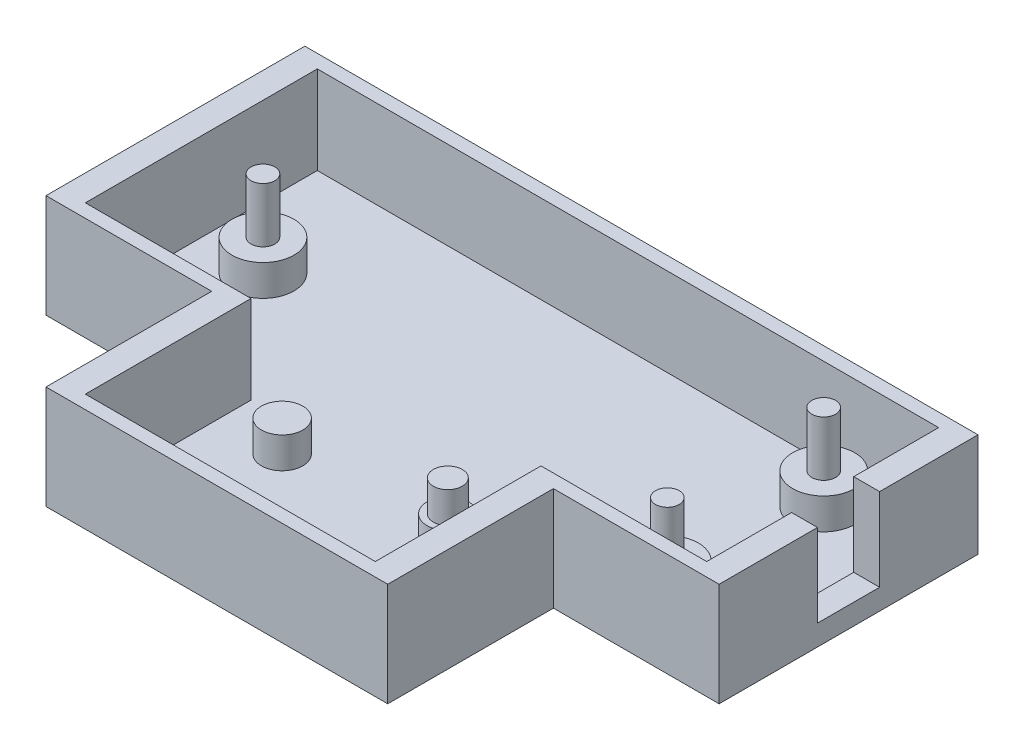
ISO-10303-21;
HEADER;
FILE_DESCRIPTION(('STEP AP214'),'2;1');
FILE_NAME('part.step','',(''),(''),'','','');
FILE_SCHEMA(('AUTOMOTIVE_DESIGN { 1 0 10303 214 1 1 1 1 }'));
ENDSEC;
DATA;
#1=APPLICATION_CONTEXT('core data for automotive mechanical design processes');
#2=APPLICATION_PROTOCOL_DEFINITION('international standard','automotive_design',2000,#1);
#3=PRODUCT_CONTEXT('',#1,'mechanical');
#4=PRODUCT('Part','Part','',(#3));
#5=PRODUCT_RELATED_PRODUCT_CATEGORY('part','',(#4));
#6=PRODUCT_DEFINITION_FORMATION('','',#4);
#7=PRODUCT_DEFINITION_CONTEXT('part definition',#1,'design');
#8=PRODUCT_DEFINITION('design','',#6,#7);
#9=PRODUCT_DEFINITION_SHAPE('','',#8);
#10=(LENGTH_UNIT() NAMED_UNIT(*) SI_UNIT(.MILLI.,.METRE.));
#11=(NAMED_UNIT(*) PLANE_ANGLE_UNIT() SI_UNIT($,.RADIAN.));
#12=(NAMED_UNIT(*) SI_UNIT($,.STERADIAN.) SOLID_ANGLE_UNIT());
#13=UNCERTAINTY_MEASURE_WITH_UNIT(LENGTH_MEASURE(1.E-05),#10,'distance_accuracy_value','');
#14=(GEOMETRIC_REPRESENTATION_CONTEXT(3) GLOBAL_UNCERTAINTY_ASSIGNED_CONTEXT((#13)) GLOBAL_UNIT_ASSIGNED_CONTEXT((#10,
#11,#12)) REPRESENTATION_CONTEXT('',''));
#15=CARTESIAN_POINT('',(0.,0.,0.));
#16=DIRECTION('',(0.,0.,1.));
#17=DIRECTION('',(1.,0.,0.));
#18=AXIS2_PLACEMENT_3D('',#15,#16,#17);
#19=CARTESIAN_POINT('',(30.,1.5,11.2));
#20=DIRECTION('',(0.,0.,1.));
#21=DIRECTION('',(1.,0.,0.));
#22=AXIS2_PLACEMENT_3D('',#19,#20,#21);
#23=PLANE('',#22);
#24=DIRECTION('',(1.,0.,0.));
#25=VECTOR('',#24,1.);
#26=CARTESIAN_POINT('',(30.,10.,11.2));
#27=LINE('',#26,#25);
#28=CARTESIAN_POINT('',(-30.,10.,11.2));
#29=VERTEX_POINT('',#28);
#30=CARTESIAN_POINT('',(-14.,10.,11.2));
#31=VERTEX_POINT('',#30);
#32=EDGE_CURVE('E363',#29,#31,#27,.T.);
#33=ORIENTED_EDGE('',*,*,#32,.T.);
#34=DIRECTION('',(0.,1.,0.));
#35=VECTOR('',#34,1.);
#36=CARTESIAN_POINT('',(-14.,-30.7490309931942,11.2));
#37=LINE('',#36,#35);
#38=CARTESIAN_POINT('',(-14.,1.5,11.2));
#39=VERTEX_POINT('',#38);
#40=EDGE_CURVE('E202',#39,#31,#37,.T.);
#41=ORIENTED_EDGE('',*,*,#40,.F.);
#42=DIRECTION('',(1.,0.,0.));
#43=VECTOR('',#42,1.);
#44=CARTESIAN_POINT('',(30.,1.5,11.2));
#45=LINE('',#44,#43);
#46=CARTESIAN_POINT('',(-30.,1.5,11.2));
#47=VERTEX_POINT('',#46);
#48=EDGE_CURVE('E347',#47,#39,#45,.T.);
#49=ORIENTED_EDGE('',*,*,#48,.F.);
#50=DIRECTION('',(0.,1.,0.));
#51=VECTOR('',#50,1.);
#52=CARTESIAN_POINT('',(-30.,1.5,11.2));
#53=LINE('',#52,#51);
#54=EDGE_CURVE('E359',#47,#29,#53,.T.);
#55=ORIENTED_EDGE('',*,*,#54,.T.);
#56=EDGE_LOOP('',(#33,#41,#49,#55));
#57=FACE_BOUND('',#56,.T.);
#58=ADVANCED_FACE('F41',(#57),#23,.F.);
#59=CARTESIAN_POINT('',(32.5,10.,12.5));
#60=DIRECTION('',(0.,0.,-1.));
#61=DIRECTION('',(-1.,0.,0.));
#62=AXIS2_PLACEMENT_3D('',#59,#60,#61);
#63=PLANE('',#62);
#64=DIRECTION('',(0.,-1.,0.));
#65=VECTOR('',#64,1.);
#66=CARTESIAN_POINT('',(-16.5,10.,12.5));
#67=LINE('',#66,#65);
#68=CARTESIAN_POINT('',(-16.5,10.,12.5));
#69=VERTEX_POINT('',#68);
#70=CARTESIAN_POINT('',(-16.5,0.,12.5));
#71=VERTEX_POINT('',#70);
#72=EDGE_CURVE('E238',#69,#71,#67,.T.);
#73=ORIENTED_EDGE('',*,*,#72,.F.);
#74=DIRECTION('',(1.,0.,0.));
#75=VECTOR('',#74,1.);
#76=CARTESIAN_POINT('',(32.5,10.,12.5));
#77=LINE('',#76,#75);
#78=CARTESIAN_POINT('',(-32.5,10.,12.5));
#79=VERTEX_POINT('',#78);
#80=EDGE_CURVE('E395',#79,#69,#77,.T.);
#81=ORIENTED_EDGE('',*,*,#80,.F.);
#82=DIRECTION('',(0.,-1.,0.));
#83=VECTOR('',#82,1.);
#84=CARTESIAN_POINT('',(-32.5,10.,12.5));
#85=LINE('',#84,#83);
#86=CARTESIAN_POINT('',(-32.5,0.,12.5));
#87=VERTEX_POINT('',#86);
#88=EDGE_CURVE('E45',#79,#87,#85,.T.);
#89=ORIENTED_EDGE('',*,*,#88,.T.);
#90=DIRECTION('',(1.,0.,0.));
#91=VECTOR('',#90,1.);
#92=CARTESIAN_POINT('',(32.5,0.,12.5));
#93=LINE('',#92,#91);
#94=EDGE_CURVE('E412',#87,#71,#93,.T.);
#95=ORIENTED_EDGE('',*,*,#94,.T.);
#96=EDGE_LOOP('',(#73,#81,#89,#95));
#97=FACE_BOUND('',#96,.T.);
#98=ADVANCED_FACE('F439',(#97),#63,.F.);
#99=CARTESIAN_POINT('',(-32.5,10.,12.5));
#100=DIRECTION('',(1.,0.,0.));
#101=DIRECTION('',(0.,0.,-1.));
#102=AXIS2_PLACEMENT_3D('',#99,#100,#101);
#103=PLANE('',#102);
#104=DIRECTION('',(0.,0.,1.));
#105=VECTOR('',#104,1.);
#106=CARTESIAN_POINT('',(-32.5,0.,12.5));
#107=LINE('',#106,#105);
#108=CARTESIAN_POINT('',(-32.5,0.,-12.5));
#109=VERTEX_POINT('',#108);
#110=EDGE_CURVE('E377',#109,#87,#107,.T.);
#111=ORIENTED_EDGE('',*,*,#110,.T.);
#112=ORIENTED_EDGE('',*,*,#88,.F.);
#113=DIRECTION('',(0.,0.,1.));
#114=VECTOR('',#113,1.);
#115=CARTESIAN_POINT('',(-32.5,10.,12.5));
#116=LINE('',#115,#114);
#117=CARTESIAN_POINT('',(-32.5,10.,-12.5));
#118=VERTEX_POINT('',#117);
#119=EDGE_CURVE('E389',#118,#79,#116,.T.);
#120=ORIENTED_EDGE('',*,*,#119,.F.);
#121=DIRECTION('',(0.,-1.,0.));
#122=VECTOR('',#121,1.);
#123=CARTESIAN_POINT('',(-32.5,10.,-12.5));
#124=LINE('',#123,#122);
#125=EDGE_CURVE('E407',#118,#109,#124,.T.);
#126=ORIENTED_EDGE('',*,*,#125,.T.);
#127=EDGE_LOOP('',(#111,#112,#120,#126));
#128=FACE_BOUND('',#127,.T.);
#129=ADVANCED_FACE('F43',(#128),#103,.F.);
#130=CARTESIAN_POINT('',(16.5,10.,12.5));
#131=VERTEX_POINT('',#130);
#132=CARTESIAN_POINT('',(32.5,10.,12.5));
#133=VERTEX_POINT('',#132);
#134=EDGE_CURVE('E393',#131,#133,#77,.T.);
#135=ORIENTED_EDGE('',*,*,#134,.F.);
#136=DIRECTION('',(0.,-1.,0.));
#137=VECTOR('',#136,1.);
#138=CARTESIAN_POINT('',(16.5,10.,12.5));
#139=LINE('',#138,#137);
#140=CARTESIAN_POINT('',(16.5,0.,12.5));
#141=VERTEX_POINT('',#140);
#142=EDGE_CURVE('E249',#131,#141,#139,.T.);
#143=ORIENTED_EDGE('',*,*,#142,.T.);
#144=CARTESIAN_POINT('',(32.5,0.,12.5));
#145=VERTEX_POINT('',#144);
#146=EDGE_CURVE('E411',#141,#145,#93,.T.);
#147=ORIENTED_EDGE('',*,*,#146,.T.);
#148=DIRECTION('',(0.,-1.,0.));
#149=VECTOR('',#148,1.);
#150=CARTESIAN_POINT('',(32.5,10.,12.5));
#151=LINE('',#150,#149);
#152=EDGE_CURVE('E427',#133,#145,#151,.T.);
#153=ORIENTED_EDGE('',*,*,#152,.F.);
#154=EDGE_LOOP('',(#135,#143,#147,#153));
#155=FACE_BOUND('',#154,.T.);
#156=ADVANCED_FACE('F584',(#155),#63,.F.);
#157=CARTESIAN_POINT('',(32.5,10.,12.5));
#158=DIRECTION('',(-1.,0.,0.));
#159=DIRECTION('',(0.,0.,1.));
#160=AXIS2_PLACEMENT_3D('',#157,#158,#159);
#161=PLANE('',#160);
#162=DIRECTION('',(0.,0.,-1.));
#163=VECTOR('',#162,1.);
#164=CARTESIAN_POINT('',(32.5,10.,12.5));
#165=LINE('',#164,#163);
#166=CARTESIAN_POINT('',(32.5,10.,-3.));
#167=VERTEX_POINT('',#166);
#168=CARTESIAN_POINT('',(32.5,10.,-12.5));
#169=VERTEX_POINT('',#168);
#170=EDGE_CURVE('E399',#167,#169,#165,.T.);
#171=ORIENTED_EDGE('',*,*,#170,.F.);
#172=DIRECTION('',(0.,1.,0.));
#173=VECTOR('',#172,1.);
#174=CARTESIAN_POINT('',(32.5,10.,-3.));
#175=LINE('',#174,#173);
#176=CARTESIAN_POINT('',(32.5,2.,-3.));
#177=VERTEX_POINT('',#176);
#178=EDGE_CURVE('E263',#177,#167,#175,.T.);
#179=ORIENTED_EDGE('',*,*,#178,.F.);
#180=DIRECTION('',(0.,0.,-1.));
#181=VECTOR('',#180,1.);
#182=CARTESIAN_POINT('',(32.5,2.,3.));
#183=LINE('',#182,#181);
#184=CARTESIAN_POINT('',(32.5,2.,3.));
#185=VERTEX_POINT('',#184);
#186=EDGE_CURVE('E267',#185,#177,#183,.T.);
#187=ORIENTED_EDGE('',*,*,#186,.F.);
#188=DIRECTION('',(0.,-1.,0.));
#189=VECTOR('',#188,1.);
#190=CARTESIAN_POINT('',(32.5,10.,3.));
#191=LINE('',#190,#189);
#192=CARTESIAN_POINT('',(32.5,10.,3.));
#193=VERTEX_POINT('',#192);
#194=EDGE_CURVE('E271',#193,#185,#191,.T.);
#195=ORIENTED_EDGE('',*,*,#194,.F.);
#196=EDGE_CURVE('E400',#133,#193,#165,.T.);
#197=ORIENTED_EDGE('',*,*,#196,.F.);
#198=ORIENTED_EDGE('',*,*,#152,.T.);
#199=DIRECTION('',(0.,0.,-1.));
#200=VECTOR('',#199,1.);
#201=CARTESIAN_POINT('',(32.5,0.,12.5));
#202=LINE('',#201,#200);
#203=CARTESIAN_POINT('',(32.5,0.,-12.5));
#204=VERTEX_POINT('',#203);
#205=EDGE_CURVE('E416',#145,#204,#202,.T.);
#206=ORIENTED_EDGE('',*,*,#205,.T.);
#207=DIRECTION('',(0.,-1.,0.));
#208=VECTOR('',#207,1.);
#209=CARTESIAN_POINT('',(32.5,10.,-12.5));
#210=LINE('',#209,#208);
#211=EDGE_CURVE('E424',#169,#204,#210,.T.);
#212=ORIENTED_EDGE('',*,*,#211,.F.);
#213=EDGE_LOOP('',(#171,#179,#187,#195,#197,#198,#206,#212));
#214=FACE_BOUND('',#213,.T.);
#215=ADVANCED_FACE('F456',(#214),#161,.F.);
#216=CARTESIAN_POINT('',(32.5,10.,-12.5));
#217=DIRECTION('',(0.,0.,1.));
#218=DIRECTION('',(1.,0.,0.));
#219=AXIS2_PLACEMENT_3D('',#216,#217,#218);
#220=PLANE('',#219);
#221=DIRECTION('',(-1.,0.,0.));
#222=VECTOR('',#221,1.);
#223=CARTESIAN_POINT('',(32.5,0.,-12.5));
#224=LINE('',#223,#222);
#225=EDGE_CURVE('E394',#204,#109,#224,.T.);
#226=ORIENTED_EDGE('',*,*,#225,.T.);
#227=ORIENTED_EDGE('',*,*,#125,.F.);
#228=DIRECTION('',(-1.,0.,0.));
#229=VECTOR('',#228,1.);
#230=CARTESIAN_POINT('',(32.5,10.,-12.5));
#231=LINE('',#230,#229);
#232=EDGE_CURVE('E404',#169,#118,#231,.T.);
#233=ORIENTED_EDGE('',*,*,#232,.F.);
#234=ORIENTED_EDGE('',*,*,#211,.T.);
#235=EDGE_LOOP('',(#226,#227,#233,#234));
#236=FACE_BOUND('',#235,.T.);
#237=ADVANCED_FACE('F455',(#236),#220,.F.);
#238=CARTESIAN_POINT('',(0.,10.,0.));
#239=DIRECTION('',(0.,1.,0.));
#240=DIRECTION('',(0.,0.,1.));
#241=AXIS2_PLACEMENT_3D('',#238,#239,#240);
#242=PLANE('',#241);
#243=DIRECTION('',(0.,0.,1.));
#244=VECTOR('',#243,1.);
#245=CARTESIAN_POINT('',(-14.,10.,11.2));
#246=LINE('',#245,#244);
#247=CARTESIAN_POINT('',(-14.,10.,27.2));
#248=VERTEX_POINT('',#247);
#249=EDGE_CURVE('E199',#31,#248,#246,.T.);
#250=ORIENTED_EDGE('',*,*,#249,.F.);
#251=ORIENTED_EDGE('',*,*,#32,.F.);
#252=DIRECTION('',(0.,0.,1.));
#253=VECTOR('',#252,1.);
#254=CARTESIAN_POINT('',(-30.,10.,11.2));
#255=LINE('',#254,#253);
#256=CARTESIAN_POINT('',(-30.,10.,-11.2));
#257=VERTEX_POINT('',#256);
#258=EDGE_CURVE('E337',#257,#29,#255,.T.);
#259=ORIENTED_EDGE('',*,*,#258,.F.);
#260=DIRECTION('',(-1.,0.,0.));
#261=VECTOR('',#260,1.);
#262=CARTESIAN_POINT('',(30.,10.,-11.2));
#263=LINE('',#262,#261);
#264=CARTESIAN_POINT('',(30.,10.,-11.2));
#265=VERTEX_POINT('',#264);
#266=EDGE_CURVE('E346',#265,#257,#263,.T.);
#267=ORIENTED_EDGE('',*,*,#266,.F.);
#268=DIRECTION('',(0.,0.,-1.));
#269=VECTOR('',#268,1.);
#270=CARTESIAN_POINT('',(30.,10.,11.2));
#271=LINE('',#270,#269);
#272=CARTESIAN_POINT('',(30.,10.,-3.));
#273=VERTEX_POINT('',#272);
#274=EDGE_CURVE('E366',#273,#265,#271,.T.);
#275=ORIENTED_EDGE('',*,*,#274,.F.);
#276=DIRECTION('',(1.,0.,0.));
#277=VECTOR('',#276,1.);
#278=CARTESIAN_POINT('',(-32.501,10.,-3.));
#279=LINE('',#278,#277);
#280=EDGE_CURVE('E285',#273,#167,#279,.T.);
#281=ORIENTED_EDGE('',*,*,#280,.T.);
#282=ORIENTED_EDGE('',*,*,#170,.T.);
#283=ORIENTED_EDGE('',*,*,#232,.T.);
#284=ORIENTED_EDGE('',*,*,#119,.T.);
#285=ORIENTED_EDGE('',*,*,#80,.T.);
#286=DIRECTION('',(0.,0.,1.));
#287=VECTOR('',#286,1.);
#288=CARTESIAN_POINT('',(-16.5,10.,28.5));
#289=LINE('',#288,#287);
#290=CARTESIAN_POINT('',(-16.5,10.,28.5));
#291=VERTEX_POINT('',#290);
#292=EDGE_CURVE('E228',#69,#291,#289,.T.);
#293=ORIENTED_EDGE('',*,*,#292,.T.);
#294=DIRECTION('',(1.,0.,0.));
#295=VECTOR('',#294,1.);
#296=CARTESIAN_POINT('',(16.5,10.,28.5));
#297=LINE('',#296,#295);
#298=CARTESIAN_POINT('',(16.5,10.,28.5));
#299=VERTEX_POINT('',#298);
#300=EDGE_CURVE('E232',#291,#299,#297,.T.);
#301=ORIENTED_EDGE('',*,*,#300,.T.);
#302=DIRECTION('',(0.,0.,-1.));
#303=VECTOR('',#302,1.);
#304=CARTESIAN_POINT('',(16.5,10.,28.5));
#305=LINE('',#304,#303);
#306=EDGE_CURVE('E235',#299,#131,#305,.T.);
#307=ORIENTED_EDGE('',*,*,#306,.T.);
#308=ORIENTED_EDGE('',*,*,#134,.T.);
#309=ORIENTED_EDGE('',*,*,#196,.T.);
#310=DIRECTION('',(1.,0.,0.));
#311=VECTOR('',#310,1.);
#312=CARTESIAN_POINT('',(-32.501,10.,3.));
#313=LINE('',#312,#311);
#314=CARTESIAN_POINT('',(30.,10.,3.));
#315=VERTEX_POINT('',#314);
#316=EDGE_CURVE('E281',#315,#193,#313,.T.);
#317=ORIENTED_EDGE('',*,*,#316,.F.);
#318=CARTESIAN_POINT('',(30.,10.,11.2));
#319=VERTEX_POINT('',#318);
#320=EDGE_CURVE('E367',#319,#315,#271,.T.);
#321=ORIENTED_EDGE('',*,*,#320,.F.);
#322=CARTESIAN_POINT('',(14.,10.,11.2));
#323=VERTEX_POINT('',#322);
#324=EDGE_CURVE('E362',#323,#319,#27,.T.);
#325=ORIENTED_EDGE('',*,*,#324,.F.);
#326=DIRECTION('',(0.,0.,-1.));
#327=VECTOR('',#326,1.);
#328=CARTESIAN_POINT('',(14.,10.,11.2));
#329=LINE('',#328,#327);
#330=CARTESIAN_POINT('',(14.,10.,27.2));
#331=VERTEX_POINT('',#330);
#332=EDGE_CURVE('E196',#331,#323,#329,.T.);
#333=ORIENTED_EDGE('',*,*,#332,.F.);
#334=DIRECTION('',(1.,0.,0.));
#335=VECTOR('',#334,1.);
#336=CARTESIAN_POINT('',(-14.,10.,27.2));
#337=LINE('',#336,#335);
#338=EDGE_CURVE('E188',#248,#331,#337,.T.);
#339=ORIENTED_EDGE('',*,*,#338,.F.);
#340=EDGE_LOOP('',(#250,#251,#259,#267,#275,#281,#282,#283,#284,#285,#293,#301,#307,#308,#309,
#317,#321,#325,#333,#339));
#341=FACE_BOUND('',#340,.T.);
#342=ADVANCED_FACE('F209',(#341),#242,.T.);
#343=CARTESIAN_POINT('',(0.,0.,0.));
#344=DIRECTION('',(0.,1.,0.));
#345=DIRECTION('',(0.,0.,1.));
#346=AXIS2_PLACEMENT_3D('',#343,#344,#345);
#347=PLANE('',#346);
#348=ORIENTED_EDGE('',*,*,#110,.F.);
#349=ORIENTED_EDGE('',*,*,#225,.F.);
#350=ORIENTED_EDGE('',*,*,#205,.F.);
#351=ORIENTED_EDGE('',*,*,#146,.F.);
#352=DIRECTION('',(0.,0.,-1.));
#353=VECTOR('',#352,1.);
#354=CARTESIAN_POINT('',(16.5,0.,28.5));
#355=LINE('',#354,#353);
#356=CARTESIAN_POINT('',(16.5,0.,28.5));
#357=VERTEX_POINT('',#356);
#358=EDGE_CURVE('E67',#357,#141,#355,.T.);
#359=ORIENTED_EDGE('',*,*,#358,.F.);
#360=DIRECTION('',(1.,0.,0.));
#361=VECTOR('',#360,1.);
#362=CARTESIAN_POINT('',(16.5,0.,28.5));
#363=LINE('',#362,#361);
#364=CARTESIAN_POINT('',(-16.5,0.,28.5));
#365=VERTEX_POINT('',#364);
#366=EDGE_CURVE('E242',#365,#357,#363,.T.);
#367=ORIENTED_EDGE('',*,*,#366,.F.);
#368=DIRECTION('',(0.,0.,1.));
#369=VECTOR('',#368,1.);
#370=CARTESIAN_POINT('',(-16.5,0.,28.5));
#371=LINE('',#370,#369);
#372=EDGE_CURVE('E226',#71,#365,#371,.T.);
#373=ORIENTED_EDGE('',*,*,#372,.F.);
#374=ORIENTED_EDGE('',*,*,#94,.F.);
#375=EDGE_LOOP('',(#348,#349,#350,#351,#359,#367,#373,#374));
#376=FACE_BOUND('',#375,.T.);
#377=ADVANCED_FACE('F446',(#376),#347,.F.);
#378=CARTESIAN_POINT('',(-30.,1.5,11.2));
#379=DIRECTION('',(-1.,0.,0.));
#380=DIRECTION('',(0.,0.,1.));
#381=AXIS2_PLACEMENT_3D('',#378,#379,#380);
#382=PLANE('',#381);
#383=ORIENTED_EDGE('',*,*,#258,.T.);
#384=ORIENTED_EDGE('',*,*,#54,.F.);
#385=DIRECTION('',(0.,0.,1.));
#386=VECTOR('',#385,1.);
#387=CARTESIAN_POINT('',(-30.,1.5,11.2));
#388=LINE('',#387,#386);
#389=CARTESIAN_POINT('',(-30.,1.5,-11.2));
#390=VERTEX_POINT('',#389);
#391=EDGE_CURVE('E341',#390,#47,#388,.T.);
#392=ORIENTED_EDGE('',*,*,#391,.F.);
#393=DIRECTION('',(0.,1.,0.));
#394=VECTOR('',#393,1.);
#395=CARTESIAN_POINT('',(-30.,1.5,-11.2));
#396=LINE('',#395,#394);
#397=EDGE_CURVE('E374',#390,#257,#396,.T.);
#398=ORIENTED_EDGE('',*,*,#397,.T.);
#399=EDGE_LOOP('',(#383,#384,#392,#398));
#400=FACE_BOUND('',#399,.T.);
#401=ADVANCED_FACE('F543',(#400),#382,.F.);
#402=CARTESIAN_POINT('',(30.,1.5,-11.2));
#403=DIRECTION('',(0.,0.,-1.));
#404=DIRECTION('',(-1.,0.,0.));
#405=AXIS2_PLACEMENT_3D('',#402,#403,#404);
#406=PLANE('',#405);
#407=ORIENTED_EDGE('',*,*,#266,.T.);
#408=ORIENTED_EDGE('',*,*,#397,.F.);
#409=DIRECTION('',(-1.,0.,0.));
#410=VECTOR('',#409,1.);
#411=CARTESIAN_POINT('',(30.,1.5,-11.2));
#412=LINE('',#411,#410);
#413=CARTESIAN_POINT('',(30.,1.5,-11.2));
#414=VERTEX_POINT('',#413);
#415=EDGE_CURVE('E355',#414,#390,#412,.T.);
#416=ORIENTED_EDGE('',*,*,#415,.F.);
#417=DIRECTION('',(0.,1.,0.));
#418=VECTOR('',#417,1.);
#419=CARTESIAN_POINT('',(30.,1.5,-11.2));
#420=LINE('',#419,#418);
#421=EDGE_CURVE('E378',#414,#265,#420,.T.);
#422=ORIENTED_EDGE('',*,*,#421,.T.);
#423=EDGE_LOOP('',(#407,#408,#416,#422));
#424=FACE_BOUND('',#423,.T.);
#425=ADVANCED_FACE('F549',(#424),#406,.F.);
#426=CARTESIAN_POINT('',(30.,1.5,11.2));
#427=DIRECTION('',(1.,0.,0.));
#428=DIRECTION('',(0.,0.,-1.));
#429=AXIS2_PLACEMENT_3D('',#426,#427,#428);
#430=PLANE('',#429);
#431=DIRECTION('',(0.,0.,1.));
#432=VECTOR('',#431,1.);
#433=CARTESIAN_POINT('',(30.,2.,3.));
#434=LINE('',#433,#432);
#435=CARTESIAN_POINT('',(30.,2.,-3.));
#436=VERTEX_POINT('',#435);
#437=CARTESIAN_POINT('',(30.,2.,3.));
#438=VERTEX_POINT('',#437);
#439=EDGE_CURVE('E259',#436,#438,#434,.T.);
#440=ORIENTED_EDGE('',*,*,#439,.F.);
#441=DIRECTION('',(0.,-1.,0.));
#442=VECTOR('',#441,1.);
#443=CARTESIAN_POINT('',(30.,10.,-3.));
#444=LINE('',#443,#442);
#445=EDGE_CURVE('E275',#273,#436,#444,.T.);
#446=ORIENTED_EDGE('',*,*,#445,.F.);
#447=ORIENTED_EDGE('',*,*,#274,.T.);
#448=ORIENTED_EDGE('',*,*,#421,.F.);
#449=DIRECTION('',(0.,0.,-1.));
#450=VECTOR('',#449,1.);
#451=CARTESIAN_POINT('',(30.,1.5,11.2));
#452=LINE('',#451,#450);
#453=CARTESIAN_POINT('',(30.,1.5,11.2));
#454=VERTEX_POINT('',#453);
#455=EDGE_CURVE('E351',#454,#414,#452,.T.);
#456=ORIENTED_EDGE('',*,*,#455,.F.);
#457=DIRECTION('',(0.,1.,0.));
#458=VECTOR('',#457,1.);
#459=CARTESIAN_POINT('',(30.,1.5,11.2));
#460=LINE('',#459,#458);
#461=EDGE_CURVE('E382',#454,#319,#460,.T.);
#462=ORIENTED_EDGE('',*,*,#461,.T.);
#463=ORIENTED_EDGE('',*,*,#320,.T.);
#464=DIRECTION('',(0.,1.,0.));
#465=VECTOR('',#464,1.);
#466=CARTESIAN_POINT('',(30.,10.,3.));
#467=LINE('',#466,#465);
#468=EDGE_CURVE('E262',#438,#315,#467,.T.);
#469=ORIENTED_EDGE('',*,*,#468,.F.);
#470=EDGE_LOOP('',(#440,#446,#447,#448,#456,#462,#463,#469));
#471=FACE_BOUND('',#470,.T.);
#472=ADVANCED_FACE('F553',(#471),#430,.F.);
#473=CARTESIAN_POINT('',(14.,1.5,11.2));
#474=VERTEX_POINT('',#473);
#475=EDGE_CURVE('E345',#474,#454,#45,.T.);
#476=ORIENTED_EDGE('',*,*,#475,.F.);
#477=DIRECTION('',(0.,1.,0.));
#478=VECTOR('',#477,1.);
#479=CARTESIAN_POINT('',(14.,-30.7490309931942,11.2));
#480=LINE('',#479,#478);
#481=EDGE_CURVE('E59',#474,#323,#480,.T.);
#482=ORIENTED_EDGE('',*,*,#481,.T.);
#483=ORIENTED_EDGE('',*,*,#324,.T.);
#484=ORIENTED_EDGE('',*,*,#461,.F.);
#485=EDGE_LOOP('',(#476,#482,#483,#484));
#486=FACE_BOUND('',#485,.T.);
#487=ADVANCED_FACE('F530',(#486),#23,.F.);
#488=CARTESIAN_POINT('',(0.,1.5,0.));
#489=DIRECTION('',(0.,1.,0.));
#490=DIRECTION('',(0.,0.,1.));
#491=AXIS2_PLACEMENT_3D('',#488,#489,#490);
#492=PLANE('',#491);
#493=CARTESIAN_POINT('',(-8.00000000000001,1.5,14.2));
#494=DIRECTION('',(0.,1.,0.));
#495=DIRECTION('',(0.,0.,-1.));
#496=AXIS2_PLACEMENT_3D('',#493,#494,#495);
#497=CIRCLE('',#496,2.);
#498=CARTESIAN_POINT('',(-8.00000000000001,1.5,12.2));
#499=VERTEX_POINT('',#498);
#500=EDGE_CURVE('E492',#499,#499,#497,.T.);
#501=ORIENTED_EDGE('',*,*,#500,.F.);
#502=EDGE_LOOP('',(#501));
#503=FACE_BOUND('',#502,.T.);
#504=CARTESIAN_POINT('',(-8.,1.5,24.2));
#505=DIRECTION('',(0.,1.,0.));
#506=DIRECTION('',(0.,0.,1.));
#507=AXIS2_PLACEMENT_3D('',#504,#505,#506);
#508=CIRCLE('',#507,2.);
#509=CARTESIAN_POINT('',(-8.,1.5,26.2));
#510=VERTEX_POINT('',#509);
#511=EDGE_CURVE('E484',#510,#510,#508,.T.);
#512=ORIENTED_EDGE('',*,*,#511,.F.);
#513=EDGE_LOOP('',(#512));
#514=FACE_BOUND('',#513,.T.);
#515=CARTESIAN_POINT('',(8.00000000000001,1.5,24.2));
#516=DIRECTION('',(0.,1.,0.));
#517=DIRECTION('',(0.,0.,-1.));
#518=AXIS2_PLACEMENT_3D('',#515,#516,#517);
#519=CIRCLE('',#518,2.);
#520=CARTESIAN_POINT('',(8.00000000000001,1.5,22.2));
#521=VERTEX_POINT('',#520);
#522=EDGE_CURVE('E476',#521,#521,#519,.T.);
#523=ORIENTED_EDGE('',*,*,#522,.F.);
#524=EDGE_LOOP('',(#523));
#525=FACE_BOUND('',#524,.T.);
#526=CARTESIAN_POINT('',(8.00000000000001,1.5,14.2));
#527=DIRECTION('',(0.,1.,0.));
#528=DIRECTION('',(0.,0.,1.));
#529=AXIS2_PLACEMENT_3D('',#526,#527,#528);
#530=CIRCLE('',#529,2.);
#531=CARTESIAN_POINT('',(8.00000000000001,1.5,16.2));
#532=VERTEX_POINT('',#531);
#533=EDGE_CURVE('E468',#532,#532,#530,.T.);
#534=ORIENTED_EDGE('',*,*,#533,.F.);
#535=EDGE_LOOP('',(#534));
#536=FACE_BOUND('',#535,.T.);
#537=CARTESIAN_POINT('',(22.55,1.5,7.55));
#538=DIRECTION('',(0.,1.,0.));
#539=DIRECTION('',(0.,0.,-1.));
#540=AXIS2_PLACEMENT_3D('',#537,#538,#539);
#541=CIRCLE('',#540,2.99999999999999);
#542=CARTESIAN_POINT('',(22.55,1.5,4.55000000000001));
#543=VERTEX_POINT('',#542);
#544=EDGE_CURVE('E313',#543,#543,#541,.T.);
#545=ORIENTED_EDGE('',*,*,#544,.F.);
#546=EDGE_LOOP('',(#545));
#547=FACE_BOUND('',#546,.T.);
#548=CARTESIAN_POINT('',(22.55,1.5,-7.55));
#549=DIRECTION('',(0.,1.,0.));
#550=DIRECTION('',(0.,0.,1.));
#551=AXIS2_PLACEMENT_3D('',#548,#549,#550);
#552=CIRCLE('',#551,2.99999999999999);
#553=CARTESIAN_POINT('',(22.55,1.5,-4.55000000000001));
#554=VERTEX_POINT('',#553);
#555=EDGE_CURVE('E321',#554,#554,#552,.T.);
#556=ORIENTED_EDGE('',*,*,#555,.F.);
#557=EDGE_LOOP('',(#556));
#558=FACE_BOUND('',#557,.T.);
#559=CARTESIAN_POINT('',(-24.05,1.5,0.));
#560=DIRECTION('',(0.,1.,0.));
#561=DIRECTION('',(0.,0.,1.));
#562=AXIS2_PLACEMENT_3D('',#559,#560,#561);
#563=CIRCLE('',#562,3.);
#564=CARTESIAN_POINT('',(-24.05,1.5,3.00000000000001));
#565=VERTEX_POINT('',#564);
#566=EDGE_CURVE('E329',#565,#565,#563,.T.);
#567=ORIENTED_EDGE('',*,*,#566,.F.);
#568=EDGE_LOOP('',(#567));
#569=FACE_BOUND('',#568,.T.);
#570=ORIENTED_EDGE('',*,*,#391,.T.);
#571=ORIENTED_EDGE('',*,*,#48,.T.);
#572=DIRECTION('',(0.,0.,-1.));
#573=VECTOR('',#572,1.);
#574=CARTESIAN_POINT('',(-14.,1.5,11.2));
#575=LINE('',#574,#573);
#576=CARTESIAN_POINT('',(-14.,1.5,27.2));
#577=VERTEX_POINT('',#576);
#578=EDGE_CURVE('E227',#577,#39,#575,.T.);
#579=ORIENTED_EDGE('',*,*,#578,.F.);
#580=DIRECTION('',(-1.,0.,0.));
#581=VECTOR('',#580,1.);
#582=CARTESIAN_POINT('',(-14.,1.5,27.2));
#583=LINE('',#582,#581);
#584=CARTESIAN_POINT('',(14.,1.5,27.2));
#585=VERTEX_POINT('',#584);
#586=EDGE_CURVE('E191',#585,#577,#583,.T.);
#587=ORIENTED_EDGE('',*,*,#586,.F.);
#588=DIRECTION('',(0.,0.,1.));
#589=VECTOR('',#588,1.);
#590=CARTESIAN_POINT('',(14.,1.5,11.2));
#591=LINE('',#590,#589);
#592=EDGE_CURVE('E219',#474,#585,#591,.T.);
#593=ORIENTED_EDGE('',*,*,#592,.F.);
#594=ORIENTED_EDGE('',*,*,#475,.T.);
#595=ORIENTED_EDGE('',*,*,#455,.T.);
#596=ORIENTED_EDGE('',*,*,#415,.T.);
#597=EDGE_LOOP('',(#570,#571,#579,#587,#593,#594,#595,#596));
#598=FACE_BOUND('',#597,.T.);
#599=ADVANCED_FACE('F526',(#503,#514,#525,#536,#547,#558,#569,#598),#492,.T.);
#600=CARTESIAN_POINT('',(-24.05,4.5,0.));
#601=DIRECTION('',(0.,-1.,0.));
#602=DIRECTION('',(0.,0.,-1.));
#603=AXIS2_PLACEMENT_3D('',#600,#601,#602);
#604=CYLINDRICAL_SURFACE('',#603,3.);
#605=CARTESIAN_POINT('',(-24.05,4.5,0.));
#606=DIRECTION('',(0.,1.,0.));
#607=DIRECTION('',(0.,0.,1.));
#608=AXIS2_PLACEMENT_3D('',#605,#606,#607);
#609=CIRCLE('',#608,3.);
#610=CARTESIAN_POINT('',(-24.05,4.5,3.00000000000001));
#611=VERTEX_POINT('',#610);
#612=EDGE_CURVE('E333',#611,#611,#609,.T.);
#613=ORIENTED_EDGE('',*,*,#612,.F.);
#614=EDGE_LOOP('',(#613));
#615=FACE_BOUND('',#614,.T.);
#616=ORIENTED_EDGE('',*,*,#566,.T.);
#617=EDGE_LOOP('',(#616));
#618=FACE_BOUND('',#617,.T.);
#619=ADVANCED_FACE('F529',(#615,#618),#604,.T.);
#620=CARTESIAN_POINT('',(-24.05,4.5,0.));
#621=DIRECTION('',(0.,1.,0.));
#622=DIRECTION('',(0.,0.,1.));
#623=AXIS2_PLACEMENT_3D('',#620,#621,#622);
#624=PLANE('',#623);
#625=CARTESIAN_POINT('',(-24.05,4.5,0.));
#626=DIRECTION('',(0.,1.,0.));
#627=DIRECTION('',(0.,0.,1.));
#628=AXIS2_PLACEMENT_3D('',#625,#626,#627);
#629=CIRCLE('',#628,1.15);
#630=CARTESIAN_POINT('',(-24.05,4.5,1.15000000000001));
#631=VERTEX_POINT('',#630);
#632=EDGE_CURVE('E309',#631,#631,#629,.T.);
#633=ORIENTED_EDGE('',*,*,#632,.F.);
#634=EDGE_LOOP('',(#633));
#635=FACE_BOUND('',#634,.T.);
#636=ORIENTED_EDGE('',*,*,#612,.T.);
#637=EDGE_LOOP('',(#636));
#638=FACE_BOUND('',#637,.T.);
#639=ADVANCED_FACE('F598',(#635,#638),#624,.T.);
#640=CARTESIAN_POINT('',(22.55,4.5,-7.55));
#641=DIRECTION('',(0.,-1.,0.));
#642=DIRECTION('',(0.,0.,-1.));
#643=AXIS2_PLACEMENT_3D('',#640,#641,#642);
#644=CYLINDRICAL_SURFACE('',#643,2.99999999999999);
#645=CARTESIAN_POINT('',(22.55,4.5,-7.55));
#646=DIRECTION('',(0.,1.,0.));
#647=DIRECTION('',(0.,0.,1.));
#648=AXIS2_PLACEMENT_3D('',#645,#646,#647);
#649=CIRCLE('',#648,2.99999999999999);
#650=CARTESIAN_POINT('',(22.55,4.5,-4.55000000000001));
#651=VERTEX_POINT('',#650);
#652=EDGE_CURVE('E325',#651,#651,#649,.T.);
#653=ORIENTED_EDGE('',*,*,#652,.F.);
#654=EDGE_LOOP('',(#653));
#655=FACE_BOUND('',#654,.T.);
#656=ORIENTED_EDGE('',*,*,#555,.T.);
#657=EDGE_LOOP('',(#656));
#658=FACE_BOUND('',#657,.T.);
#659=ADVANCED_FACE('F602',(#655,#658),#644,.T.);
#660=CARTESIAN_POINT('',(22.55,4.5,-7.55));
#661=DIRECTION('',(0.,1.,0.));
#662=DIRECTION('',(0.,0.,1.));
#663=AXIS2_PLACEMENT_3D('',#660,#661,#662);
#664=PLANE('',#663);
#665=CARTESIAN_POINT('',(22.55,4.5,-7.55));
#666=DIRECTION('',(0.,1.,0.));
#667=DIRECTION('',(0.,0.,1.));
#668=AXIS2_PLACEMENT_3D('',#665,#666,#667);
#669=CIRCLE('',#668,1.15);
#670=CARTESIAN_POINT('',(22.55,4.5,-6.4));
#671=VERTEX_POINT('',#670);
#672=EDGE_CURVE('E301',#671,#671,#669,.T.);
#673=ORIENTED_EDGE('',*,*,#672,.F.);
#674=EDGE_LOOP('',(#673));
#675=FACE_BOUND('',#674,.T.);
#676=ORIENTED_EDGE('',*,*,#652,.T.);
#677=EDGE_LOOP('',(#676));
#678=FACE_BOUND('',#677,.T.);
#679=ADVANCED_FACE('F606',(#675,#678),#664,.T.);
#680=CARTESIAN_POINT('',(22.55,4.5,7.55));
#681=DIRECTION('',(0.,-1.,0.));
#682=DIRECTION('',(0.,0.,-1.));
#683=AXIS2_PLACEMENT_3D('',#680,#681,#682);
#684=CYLINDRICAL_SURFACE('',#683,2.99999999999999);
#685=CARTESIAN_POINT('',(22.55,4.5,7.55));
#686=DIRECTION('',(0.,1.,0.));
#687=DIRECTION('',(0.,0.,-1.));
#688=AXIS2_PLACEMENT_3D('',#685,#686,#687);
#689=CIRCLE('',#688,2.99999999999999);
#690=CARTESIAN_POINT('',(22.55,4.5,4.55000000000001));
#691=VERTEX_POINT('',#690);
#692=EDGE_CURVE('E317',#691,#691,#689,.T.);
#693=ORIENTED_EDGE('',*,*,#692,.F.);
#694=EDGE_LOOP('',(#693));
#695=FACE_BOUND('',#694,.T.);
#696=ORIENTED_EDGE('',*,*,#544,.T.);
#697=EDGE_LOOP('',(#696));
#698=FACE_BOUND('',#697,.T.);
#699=ADVANCED_FACE('F610',(#695,#698),#684,.T.);
#700=CARTESIAN_POINT('',(22.55,4.5,7.55));
#701=DIRECTION('',(0.,-1.,0.));
#702=DIRECTION('',(0.,0.,-1.));
#703=AXIS2_PLACEMENT_3D('',#700,#701,#702);
#704=PLANE('',#703);
#705=CARTESIAN_POINT('',(22.55,4.5,7.55));
#706=DIRECTION('',(0.,1.,0.));
#707=DIRECTION('',(0.,0.,1.));
#708=AXIS2_PLACEMENT_3D('',#705,#706,#707);
#709=CIRCLE('',#708,1.15);
#710=CARTESIAN_POINT('',(22.55,4.5,8.70000000000001));
#711=VERTEX_POINT('',#710);
#712=EDGE_CURVE('E51',#711,#711,#709,.T.);
#713=ORIENTED_EDGE('',*,*,#712,.F.);
#714=EDGE_LOOP('',(#713));
#715=FACE_BOUND('',#714,.T.);
#716=ORIENTED_EDGE('',*,*,#692,.T.);
#717=EDGE_LOOP('',(#716));
#718=FACE_BOUND('',#717,.T.);
#719=ADVANCED_FACE('F614',(#715,#718),#704,.F.);
#720=CARTESIAN_POINT('',(-24.05,9.8,0.));
#721=DIRECTION('',(0.,-1.,0.));
#722=DIRECTION('',(0.,0.,-1.));
#723=AXIS2_PLACEMENT_3D('',#720,#721,#722);
#724=CYLINDRICAL_SURFACE('',#723,1.15);
#725=CARTESIAN_POINT('',(-24.05,9.8,0.));
#726=DIRECTION('',(0.,1.,0.));
#727=DIRECTION('',(0.,0.,1.));
#728=AXIS2_PLACEMENT_3D('',#725,#726,#727);
#729=CIRCLE('',#728,1.15);
#730=CARTESIAN_POINT('',(-24.05,9.8,1.15000000000001));
#731=VERTEX_POINT('',#730);
#732=EDGE_CURVE('E305',#731,#731,#729,.T.);
#733=ORIENTED_EDGE('',*,*,#732,.F.);
#734=EDGE_LOOP('',(#733));
#735=FACE_BOUND('',#734,.T.);
#736=ORIENTED_EDGE('',*,*,#632,.T.);
#737=EDGE_LOOP('',(#736));
#738=FACE_BOUND('',#737,.T.);
#739=ADVANCED_FACE('F618',(#735,#738),#724,.T.);
#740=CARTESIAN_POINT('',(-24.05,9.8,0.));
#741=DIRECTION('',(0.,1.,0.));
#742=DIRECTION('',(0.,0.,1.));
#743=AXIS2_PLACEMENT_3D('',#740,#741,#742);
#744=PLANE('',#743);
#745=ORIENTED_EDGE('',*,*,#732,.T.);
#746=EDGE_LOOP('',(#745));
#747=FACE_BOUND('',#746,.T.);
#748=ADVANCED_FACE('F622',(#747),#744,.T.);
#749=CARTESIAN_POINT('',(22.55,9.8,-7.55));
#750=DIRECTION('',(0.,-1.,0.));
#751=DIRECTION('',(0.,0.,-1.));
#752=AXIS2_PLACEMENT_3D('',#749,#750,#751);
#753=CYLINDRICAL_SURFACE('',#752,1.15);
#754=CARTESIAN_POINT('',(22.55,9.8,-7.55));
#755=DIRECTION('',(0.,1.,0.));
#756=DIRECTION('',(0.,0.,1.));
#757=AXIS2_PLACEMENT_3D('',#754,#755,#756);
#758=CIRCLE('',#757,1.15);
#759=CARTESIAN_POINT('',(22.55,9.8,-6.4));
#760=VERTEX_POINT('',#759);
#761=EDGE_CURVE('E297',#760,#760,#758,.T.);
#762=ORIENTED_EDGE('',*,*,#761,.F.);
#763=EDGE_LOOP('',(#762));
#764=FACE_BOUND('',#763,.T.);
#765=ORIENTED_EDGE('',*,*,#672,.T.);
#766=EDGE_LOOP('',(#765));
#767=FACE_BOUND('',#766,.T.);
#768=ADVANCED_FACE('F626',(#764,#767),#753,.T.);
#769=CARTESIAN_POINT('',(22.55,9.8,-7.55));
#770=DIRECTION('',(0.,1.,0.));
#771=DIRECTION('',(0.,0.,1.));
#772=AXIS2_PLACEMENT_3D('',#769,#770,#771);
#773=PLANE('',#772);
#774=ORIENTED_EDGE('',*,*,#761,.T.);
#775=EDGE_LOOP('',(#774));
#776=FACE_BOUND('',#775,.T.);
#777=ADVANCED_FACE('F630',(#776),#773,.T.);
#778=CARTESIAN_POINT('',(22.55,9.8,7.55));
#779=DIRECTION('',(0.,-1.,0.));
#780=DIRECTION('',(0.,0.,-1.));
#781=AXIS2_PLACEMENT_3D('',#778,#779,#780);
#782=CYLINDRICAL_SURFACE('',#781,1.15);
#783=CARTESIAN_POINT('',(22.55,9.8,7.55));
#784=DIRECTION('',(0.,1.,0.));
#785=DIRECTION('',(0.,0.,1.));
#786=AXIS2_PLACEMENT_3D('',#783,#784,#785);
#787=CIRCLE('',#786,1.15);
#788=CARTESIAN_POINT('',(22.55,9.8,8.70000000000001));
#789=VERTEX_POINT('',#788);
#790=EDGE_CURVE('E293',#789,#789,#787,.T.);
#791=ORIENTED_EDGE('',*,*,#790,.F.);
#792=EDGE_LOOP('',(#791));
#793=FACE_BOUND('',#792,.T.);
#794=ORIENTED_EDGE('',*,*,#712,.T.);
#795=EDGE_LOOP('',(#794));
#796=FACE_BOUND('',#795,.T.);
#797=ADVANCED_FACE('F634',(#793,#796),#782,.T.);
#798=CARTESIAN_POINT('',(22.55,9.8,7.55));
#799=DIRECTION('',(0.,1.,0.));
#800=DIRECTION('',(0.,0.,1.));
#801=AXIS2_PLACEMENT_3D('',#798,#799,#800);
#802=PLANE('',#801);
#803=ORIENTED_EDGE('',*,*,#790,.T.);
#804=EDGE_LOOP('',(#803));
#805=FACE_BOUND('',#804,.T.);
#806=ADVANCED_FACE('F577',(#805),#802,.T.);
#807=CARTESIAN_POINT('',(-32.501,2.,3.));
#808=DIRECTION('',(0.,-1.,0.));
#809=DIRECTION('',(0.,0.,-1.));
#810=AXIS2_PLACEMENT_3D('',#807,#808,#809);
#811=PLANE('',#810);
#812=ORIENTED_EDGE('',*,*,#439,.T.);
#813=DIRECTION('',(1.,0.,0.));
#814=VECTOR('',#813,1.);
#815=CARTESIAN_POINT('',(-32.501,2.,3.));
#816=LINE('',#815,#814);
#817=EDGE_CURVE('E284',#438,#185,#816,.T.);
#818=ORIENTED_EDGE('',*,*,#817,.T.);
#819=ORIENTED_EDGE('',*,*,#186,.T.);
#820=DIRECTION('',(1.,0.,0.));
#821=VECTOR('',#820,1.);
#822=CARTESIAN_POINT('',(-32.501,2.,-3.));
#823=LINE('',#822,#821);
#824=EDGE_CURVE('E266',#436,#177,#823,.T.);
#825=ORIENTED_EDGE('',*,*,#824,.F.);
#826=EDGE_LOOP('',(#812,#818,#819,#825));
#827=FACE_BOUND('',#826,.T.);
#828=ADVANCED_FACE('F567',(#827),#811,.F.);
#829=CARTESIAN_POINT('',(-32.501,10.,-3.));
#830=DIRECTION('',(0.,0.,-1.));
#831=DIRECTION('',(0.,1.,0.));
#832=AXIS2_PLACEMENT_3D('',#829,#830,#831);
#833=PLANE('',#832);
#834=ORIENTED_EDGE('',*,*,#445,.T.);
#835=ORIENTED_EDGE('',*,*,#824,.T.);
#836=ORIENTED_EDGE('',*,*,#178,.T.);
#837=ORIENTED_EDGE('',*,*,#280,.F.);
#838=EDGE_LOOP('',(#834,#835,#836,#837));
#839=FACE_BOUND('',#838,.T.);
#840=ADVANCED_FACE('F569',(#839),#833,.F.);
#841=CARTESIAN_POINT('',(-32.501,10.,3.));
#842=DIRECTION('',(0.,0.,1.));
#843=DIRECTION('',(0.,-1.,0.));
#844=AXIS2_PLACEMENT_3D('',#841,#842,#843);
#845=PLANE('',#844);
#846=ORIENTED_EDGE('',*,*,#468,.T.);
#847=ORIENTED_EDGE('',*,*,#316,.T.);
#848=ORIENTED_EDGE('',*,*,#194,.T.);
#849=ORIENTED_EDGE('',*,*,#817,.F.);
#850=EDGE_LOOP('',(#846,#847,#848,#849));
#851=FACE_BOUND('',#850,.T.);
#852=ADVANCED_FACE('F563',(#851),#845,.F.);
#853=CARTESIAN_POINT('',(-16.5,10.,28.5));
#854=DIRECTION('',(1.,0.,0.));
#855=DIRECTION('',(0.,0.,-1.));
#856=AXIS2_PLACEMENT_3D('',#853,#854,#855);
#857=PLANE('',#856);
#858=ORIENTED_EDGE('',*,*,#372,.T.);
#859=DIRECTION('',(0.,-1.,0.));
#860=VECTOR('',#859,1.);
#861=CARTESIAN_POINT('',(-16.5,10.,28.5));
#862=LINE('',#861,#860);
#863=EDGE_CURVE('E255',#291,#365,#862,.T.);
#864=ORIENTED_EDGE('',*,*,#863,.F.);
#865=ORIENTED_EDGE('',*,*,#292,.F.);
#866=ORIENTED_EDGE('',*,*,#72,.T.);
#867=EDGE_LOOP('',(#858,#864,#865,#866));
#868=FACE_BOUND('',#867,.T.);
#869=ADVANCED_FACE('F450',(#868),#857,.F.);
#870=CARTESIAN_POINT('',(16.5,10.,28.5));
#871=DIRECTION('',(0.,0.,-1.));
#872=DIRECTION('',(-1.,0.,0.));
#873=AXIS2_PLACEMENT_3D('',#870,#871,#872);
#874=PLANE('',#873);
#875=ORIENTED_EDGE('',*,*,#366,.T.);
#876=DIRECTION('',(0.,-1.,0.));
#877=VECTOR('',#876,1.);
#878=CARTESIAN_POINT('',(16.5,10.,28.5));
#879=LINE('',#878,#877);
#880=EDGE_CURVE('E252',#299,#357,#879,.T.);
#881=ORIENTED_EDGE('',*,*,#880,.F.);
#882=ORIENTED_EDGE('',*,*,#300,.F.);
#883=ORIENTED_EDGE('',*,*,#863,.T.);
#884=EDGE_LOOP('',(#875,#881,#882,#883));
#885=FACE_BOUND('',#884,.T.);
#886=ADVANCED_FACE('F706',(#885),#874,.F.);
#887=CARTESIAN_POINT('',(16.5,10.,28.5));
#888=DIRECTION('',(-1.,0.,0.));
#889=DIRECTION('',(0.,0.,1.));
#890=AXIS2_PLACEMENT_3D('',#887,#888,#889);
#891=PLANE('',#890);
#892=ORIENTED_EDGE('',*,*,#358,.T.);
#893=ORIENTED_EDGE('',*,*,#142,.F.);
#894=ORIENTED_EDGE('',*,*,#306,.F.);
#895=ORIENTED_EDGE('',*,*,#880,.T.);
#896=EDGE_LOOP('',(#892,#893,#894,#895));
#897=FACE_BOUND('',#896,.T.);
#898=ADVANCED_FACE('F715',(#897),#891,.F.);
#899=CARTESIAN_POINT('',(-14.,-30.7490309931942,11.2));
#900=DIRECTION('',(-1.,0.,0.));
#901=DIRECTION('',(0.,0.,1.));
#902=AXIS2_PLACEMENT_3D('',#899,#900,#901);
#903=PLANE('',#902);
#904=ORIENTED_EDGE('',*,*,#578,.T.);
#905=ORIENTED_EDGE('',*,*,#40,.T.);
#906=ORIENTED_EDGE('',*,*,#249,.T.);
#907=DIRECTION('',(0.,1.,0.));
#908=VECTOR('',#907,1.);
#909=CARTESIAN_POINT('',(-14.,-30.7490309931942,27.2));
#910=LINE('',#909,#908);
#911=EDGE_CURVE('E183',#577,#248,#910,.T.);
#912=ORIENTED_EDGE('',*,*,#911,.F.);
#913=EDGE_LOOP('',(#904,#905,#906,#912));
#914=FACE_BOUND('',#913,.T.);
#915=ADVANCED_FACE('F200',(#914),#903,.F.);
#916=CARTESIAN_POINT('',(14.,-30.7490309931942,11.2));
#917=DIRECTION('',(1.,0.,0.));
#918=DIRECTION('',(0.,0.,-1.));
#919=AXIS2_PLACEMENT_3D('',#916,#917,#918);
#920=PLANE('',#919);
#921=ORIENTED_EDGE('',*,*,#592,.T.);
#922=DIRECTION('',(0.,1.,0.));
#923=VECTOR('',#922,1.);
#924=CARTESIAN_POINT('',(14.,-30.7490309931942,27.2));
#925=LINE('',#924,#923);
#926=EDGE_CURVE('E195',#585,#331,#925,.T.);
#927=ORIENTED_EDGE('',*,*,#926,.T.);
#928=ORIENTED_EDGE('',*,*,#332,.T.);
#929=ORIENTED_EDGE('',*,*,#481,.F.);
#930=EDGE_LOOP('',(#921,#927,#928,#929));
#931=FACE_BOUND('',#930,.T.);
#932=ADVANCED_FACE('F751',(#931),#920,.F.);
#933=CARTESIAN_POINT('',(-14.,-30.7490309931942,27.2));
#934=DIRECTION('',(0.,0.,1.));
#935=DIRECTION('',(1.,0.,0.));
#936=AXIS2_PLACEMENT_3D('',#933,#934,#935);
#937=PLANE('',#936);
#938=ORIENTED_EDGE('',*,*,#586,.T.);
#939=ORIENTED_EDGE('',*,*,#911,.T.);
#940=ORIENTED_EDGE('',*,*,#338,.T.);
#941=ORIENTED_EDGE('',*,*,#926,.F.);
#942=EDGE_LOOP('',(#938,#939,#940,#941));
#943=FACE_BOUND('',#942,.T.);
#944=ADVANCED_FACE('F185',(#943),#937,.F.);
#945=CARTESIAN_POINT('',(8.00000000000001,4.5,14.2));
#946=DIRECTION('',(0.,-1.,0.));
#947=DIRECTION('',(0.,0.,-1.));
#948=AXIS2_PLACEMENT_3D('',#945,#946,#947);
#949=CYLINDRICAL_SURFACE('',#948,2.);
#950=CARTESIAN_POINT('',(8.00000000000001,4.5,14.2));
#951=DIRECTION('',(0.,1.,0.));
#952=DIRECTION('',(0.,0.,1.));
#953=AXIS2_PLACEMENT_3D('',#950,#951,#952);
#954=CIRCLE('',#953,2.);
#955=CARTESIAN_POINT('',(8.00000000000001,4.5,16.2));
#956=VERTEX_POINT('',#955);
#957=EDGE_CURVE('E207',#956,#956,#954,.T.);
#958=ORIENTED_EDGE('',*,*,#957,.F.);
#959=EDGE_LOOP('',(#958));
#960=FACE_BOUND('',#959,.T.);
#961=ORIENTED_EDGE('',*,*,#533,.T.);
#962=EDGE_LOOP('',(#961));
#963=FACE_BOUND('',#962,.T.);
#964=ADVANCED_FACE('F517',(#960,#963),#949,.T.);
#965=CARTESIAN_POINT('',(8.00000000000001,4.5,14.2));
#966=DIRECTION('',(0.,1.,0.));
#967=DIRECTION('',(0.,0.,1.));
#968=AXIS2_PLACEMENT_3D('',#965,#966,#967);
#969=PLANE('',#968);
#970=CARTESIAN_POINT('',(8.00000000000001,4.5,14.2));
#971=DIRECTION('',(0.,1.,0.));
#972=DIRECTION('',(0.,0.,1.));
#973=AXIS2_PLACEMENT_3D('',#970,#971,#972);
#974=CIRCLE('',#973,1.4);
#975=CARTESIAN_POINT('',(8.00000000000001,4.5,15.6));
#976=VERTEX_POINT('',#975);
#977=EDGE_CURVE('E11',#976,#976,#974,.T.);
#978=ORIENTED_EDGE('',*,*,#977,.F.);
#979=EDGE_LOOP('',(#978));
#980=FACE_BOUND('',#979,.T.);
#981=ORIENTED_EDGE('',*,*,#957,.T.);
#982=EDGE_LOOP('',(#981));
#983=FACE_BOUND('',#982,.T.);
#984=ADVANCED_FACE('F513',(#980,#983),#969,.T.);
#985=CARTESIAN_POINT('',(8.00000000000001,4.5,24.2));
#986=DIRECTION('',(0.,-1.,0.));
#987=DIRECTION('',(0.,0.,-1.));
#988=AXIS2_PLACEMENT_3D('',#985,#986,#987);
#989=CYLINDRICAL_SURFACE('',#988,2.);
#990=CARTESIAN_POINT('',(8.00000000000001,4.5,24.2));
#991=DIRECTION('',(0.,1.,0.));
#992=DIRECTION('',(0.,0.,-1.));
#993=AXIS2_PLACEMENT_3D('',#990,#991,#992);
#994=CIRCLE('',#993,2.);
#995=CARTESIAN_POINT('',(8.00000000000001,4.5,22.2));
#996=VERTEX_POINT('',#995);
#997=EDGE_CURVE('E472',#996,#996,#994,.T.);
#998=ORIENTED_EDGE('',*,*,#997,.F.);
#999=EDGE_LOOP('',(#998));
#1000=FACE_BOUND('',#999,.T.);
#1001=ORIENTED_EDGE('',*,*,#522,.T.);
#1002=EDGE_LOOP('',(#1001));
#1003=FACE_BOUND('',#1002,.T.);
#1004=ADVANCED_FACE('F516',(#1000,#1003),#989,.T.);
#1005=CARTESIAN_POINT('',(8.00000000000001,4.5,24.2));
#1006=DIRECTION('',(0.,-1.,0.));
#1007=DIRECTION('',(0.,0.,-1.));
#1008=AXIS2_PLACEMENT_3D('',#1005,#1006,#1007);
#1009=PLANE('',#1008);
#1010=ORIENTED_EDGE('',*,*,#997,.T.);
#1011=EDGE_LOOP('',(#1010));
#1012=FACE_BOUND('',#1011,.T.);
#1013=ADVANCED_FACE('F788',(#1012),#1009,.F.);
#1014=CARTESIAN_POINT('',(-8.,4.5,24.2));
#1015=DIRECTION('',(0.,-1.,0.));
#1016=DIRECTION('',(0.,0.,-1.));
#1017=AXIS2_PLACEMENT_3D('',#1014,#1015,#1016);
#1018=CYLINDRICAL_SURFACE('',#1017,2.);
#1019=CARTESIAN_POINT('',(-8.,4.5,24.2));
#1020=DIRECTION('',(0.,1.,0.));
#1021=DIRECTION('',(0.,0.,1.));
#1022=AXIS2_PLACEMENT_3D('',#1019,#1020,#1021);
#1023=CIRCLE('',#1022,2.);
#1024=CARTESIAN_POINT('',(-8.,4.5,26.2));
#1025=VERTEX_POINT('',#1024);
#1026=EDGE_CURVE('E480',#1025,#1025,#1023,.T.);
#1027=ORIENTED_EDGE('',*,*,#1026,.F.);
#1028=EDGE_LOOP('',(#1027));
#1029=FACE_BOUND('',#1028,.T.);
#1030=ORIENTED_EDGE('',*,*,#511,.T.);
#1031=EDGE_LOOP('',(#1030));
#1032=FACE_BOUND('',#1031,.T.);
#1033=ADVANCED_FACE('F798',(#1029,#1032),#1018,.T.);
#1034=CARTESIAN_POINT('',(-8.,4.5,24.2));
#1035=DIRECTION('',(0.,1.,0.));
#1036=DIRECTION('',(0.,0.,1.));
#1037=AXIS2_PLACEMENT_3D('',#1034,#1035,#1036);
#1038=PLANE('',#1037);
#1039=ORIENTED_EDGE('',*,*,#1026,.T.);
#1040=EDGE_LOOP('',(#1039));
#1041=FACE_BOUND('',#1040,.T.);
#1042=ADVANCED_FACE('F808',(#1041),#1038,.T.);
#1043=CARTESIAN_POINT('',(-8.00000000000001,4.5,14.2));
#1044=DIRECTION('',(0.,-1.,0.));
#1045=DIRECTION('',(0.,0.,-1.));
#1046=AXIS2_PLACEMENT_3D('',#1043,#1044,#1045);
#1047=CYLINDRICAL_SURFACE('',#1046,2.);
#1048=CARTESIAN_POINT('',(-8.00000000000001,4.5,14.2));
#1049=DIRECTION('',(0.,1.,0.));
#1050=DIRECTION('',(0.,0.,-1.));
#1051=AXIS2_PLACEMENT_3D('',#1048,#1049,#1050);
#1052=CIRCLE('',#1051,2.);
#1053=CARTESIAN_POINT('',(-8.00000000000001,4.5,12.2));
#1054=VERTEX_POINT('',#1053);
#1055=EDGE_CURVE('E488',#1054,#1054,#1052,.T.);
#1056=ORIENTED_EDGE('',*,*,#1055,.F.);
#1057=EDGE_LOOP('',(#1056));
#1058=FACE_BOUND('',#1057,.T.);
#1059=ORIENTED_EDGE('',*,*,#500,.T.);
#1060=EDGE_LOOP('',(#1059));
#1061=FACE_BOUND('',#1060,.T.);
#1062=ADVANCED_FACE('F818',(#1058,#1061),#1047,.T.);
#1063=CARTESIAN_POINT('',(-8.00000000000001,4.5,14.2));
#1064=DIRECTION('',(0.,-1.,0.));
#1065=DIRECTION('',(0.,0.,-1.));
#1066=AXIS2_PLACEMENT_3D('',#1063,#1064,#1065);
#1067=PLANE('',#1066);
#1068=ORIENTED_EDGE('',*,*,#1055,.T.);
#1069=EDGE_LOOP('',(#1068));
#1070=FACE_BOUND('',#1069,.T.);
#1071=ADVANCED_FACE('F509',(#1070),#1067,.F.);
#1072=CARTESIAN_POINT('',(8.00000000000001,7.5,14.2));
#1073=DIRECTION('',(0.,-1.,0.));
#1074=DIRECTION('',(0.,0.,-1.));
#1075=AXIS2_PLACEMENT_3D('',#1072,#1073,#1074);
#1076=CYLINDRICAL_SURFACE('',#1075,1.4);
#1077=CARTESIAN_POINT('',(8.00000000000001,7.5,14.2));
#1078=DIRECTION('',(0.,1.,0.));
#1079=DIRECTION('',(0.,0.,1.));
#1080=AXIS2_PLACEMENT_3D('',#1077,#1078,#1079);
#1081=CIRCLE('',#1080,1.4);
#1082=CARTESIAN_POINT('',(8.00000000000001,7.5,15.6));
#1083=VERTEX_POINT('',#1082);
#1084=EDGE_CURVE('E496',#1083,#1083,#1081,.T.);
#1085=ORIENTED_EDGE('',*,*,#1084,.F.);
#1086=EDGE_LOOP('',(#1085));
#1087=FACE_BOUND('',#1086,.T.);
#1088=ORIENTED_EDGE('',*,*,#977,.T.);
#1089=EDGE_LOOP('',(#1088));
#1090=FACE_BOUND('',#1089,.T.);
#1091=ADVANCED_FACE('F506',(#1087,#1090),#1076,.T.);
#1092=CARTESIAN_POINT('',(8.00000000000001,7.5,14.2));
#1093=DIRECTION('',(0.,1.,0.));
#1094=DIRECTION('',(0.,0.,1.));
#1095=AXIS2_PLACEMENT_3D('',#1092,#1093,#1094);
#1096=PLANE('',#1095);
#1097=ORIENTED_EDGE('',*,*,#1084,.T.);
#1098=EDGE_LOOP('',(#1097));
#1099=FACE_BOUND('',#1098,.T.);
#1100=ADVANCED_FACE('F504',(#1099),#1096,.T.);
#1101=CLOSED_SHELL('',(#58,#98,#129,#156,#215,#237,#342,#377,#401,#425,#472,#487,#599,#619,#639,
#659,#679,#699,#719,#739,#748,#768,#777,#797,#806,#828,#840,#852,#869,#886,#898,#915,#932,#944,
#964,#984,#1004,#1013,#1033,#1042,#1062,#1071,#1091,#1100));
#1102=MANIFOLD_SOLID_BREP('B2',#1101);
#1103=ADVANCED_BREP_SHAPE_REPRESENTATION('',(#18,#1102),#14);
#1104=SHAPE_DEFINITION_REPRESENTATION(#9,#1103);
ENDSEC;
END-ISO-10303-21;
